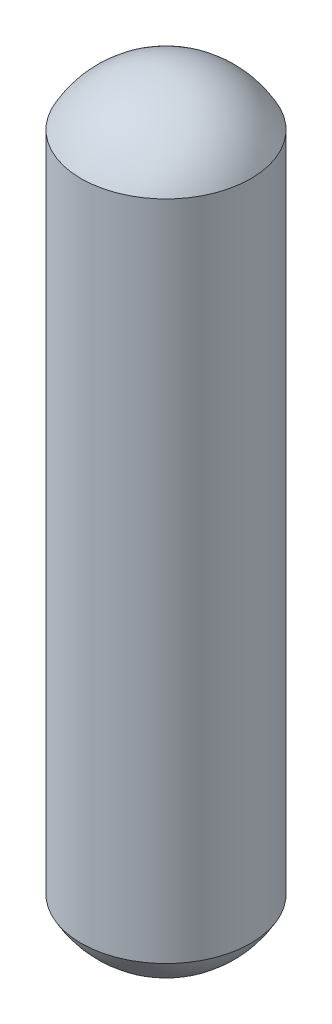
ISO-10303-21;
HEADER;
FILE_DESCRIPTION(('STEP AP214'),'2;1');
FILE_NAME('part.step','',(''),(''),'','','');
FILE_SCHEMA(('AUTOMOTIVE_DESIGN { 1 0 10303 214 1 1 1 1 }'));
ENDSEC;
DATA;
#1=APPLICATION_CONTEXT('core data for automotive mechanical design processes');
#2=APPLICATION_PROTOCOL_DEFINITION('international standard','automotive_design',2000,#1);
#3=PRODUCT_CONTEXT('',#1,'mechanical');
#4=PRODUCT('Part','Part','',(#3));
#5=PRODUCT_RELATED_PRODUCT_CATEGORY('part','',(#4));
#6=PRODUCT_DEFINITION_FORMATION('','',#4);
#7=PRODUCT_DEFINITION_CONTEXT('part definition',#1,'design');
#8=PRODUCT_DEFINITION('design','',#6,#7);
#9=PRODUCT_DEFINITION_SHAPE('','',#8);
#10=(LENGTH_UNIT() NAMED_UNIT(*) SI_UNIT(.MILLI.,.METRE.));
#11=(NAMED_UNIT(*) PLANE_ANGLE_UNIT() SI_UNIT($,.RADIAN.));
#12=(NAMED_UNIT(*) SI_UNIT($,.STERADIAN.) SOLID_ANGLE_UNIT());
#13=UNCERTAINTY_MEASURE_WITH_UNIT(LENGTH_MEASURE(1.E-05),#10,'distance_accuracy_value','');
#14=(GEOMETRIC_REPRESENTATION_CONTEXT(3) GLOBAL_UNCERTAINTY_ASSIGNED_CONTEXT((#13)) GLOBAL_UNIT_ASSIGNED_CONTEXT((#10,
#11,#12)) REPRESENTATION_CONTEXT('',''));
#15=CARTESIAN_POINT('',(0.,0.,0.));
#16=DIRECTION('',(0.,0.,1.));
#17=DIRECTION('',(1.,0.,0.));
#18=AXIS2_PLACEMENT_3D('',#15,#16,#17);
#19=CARTESIAN_POINT('',(0.,-2.26666666666667,0.));
#20=DIRECTION('',(0.,1.,0.));
#21=DIRECTION('',(1.,0.,0.));
#22=AXIS2_PLACEMENT_3D('',#19,#20,#21);
#23=SPHERICAL_SURFACE('',#22,2.26666666666667);
#24=CARTESIAN_POINT('',(0.,-1.2,0.));
#25=DIRECTION('',(0.,1.,0.));
#26=DIRECTION('',(-1.,0.,0.));
#27=AXIS2_PLACEMENT_3D('',#24,#25,#26);
#28=CIRCLE('',#27,2.);
#29=CARTESIAN_POINT('',(-2.,-1.2,0.));
#30=VERTEX_POINT('',#29);
#31=EDGE_CURVE('E10',#30,#30,#28,.T.);
#32=ORIENTED_EDGE('',*,*,#31,.T.);
#33=EDGE_LOOP('',(#32));
#34=FACE_BOUND('',#33,.T.);
#35=ADVANCED_FACE('F39',(#34),#23,.T.);
#36=CARTESIAN_POINT('',(0.,5.,0.));
#37=DIRECTION('',(0.,1.,0.));
#38=DIRECTION('',(-1.,0.,0.));
#39=AXIS2_PLACEMENT_3D('',#36,#37,#38);
#40=CYLINDRICAL_SURFACE('',#39,2.);
#41=ORIENTED_EDGE('',*,*,#31,.F.);
#42=EDGE_LOOP('',(#41));
#43=FACE_BOUND('',#42,.T.);
#44=CARTESIAN_POINT('',(0.,-16.8,0.));
#45=DIRECTION('',(0.,1.,0.));
#46=DIRECTION('',(-1.,0.,0.));
#47=AXIS2_PLACEMENT_3D('',#44,#45,#46);
#48=CIRCLE('',#47,2.);
#49=CARTESIAN_POINT('',(-2.,-16.8,0.));
#50=VERTEX_POINT('',#49);
#51=EDGE_CURVE('E45',#50,#50,#48,.T.);
#52=ORIENTED_EDGE('',*,*,#51,.T.);
#53=EDGE_LOOP('',(#52));
#54=FACE_BOUND('',#53,.T.);
#55=ADVANCED_FACE('F51',(#43,#54),#40,.T.);
#56=CARTESIAN_POINT('',(0.,-15.7333333333333,0.));
#57=DIRECTION('',(0.,1.,0.));
#58=DIRECTION('',(1.,0.,0.));
#59=AXIS2_PLACEMENT_3D('',#56,#57,#58);
#60=SPHERICAL_SURFACE('',#59,2.26666666666666);
#61=ORIENTED_EDGE('',*,*,#51,.F.);
#62=EDGE_LOOP('',(#61));
#63=FACE_BOUND('',#62,.T.);
#64=ADVANCED_FACE('F53',(#63),#60,.T.);
#65=CLOSED_SHELL('',(#35,#55,#64));
#66=MANIFOLD_SOLID_BREP('B2',#65);
#67=ADVANCED_BREP_SHAPE_REPRESENTATION('',(#18,#66),#14);
#68=SHAPE_DEFINITION_REPRESENTATION(#9,#67);
ENDSEC;
END-ISO-10303-21;
